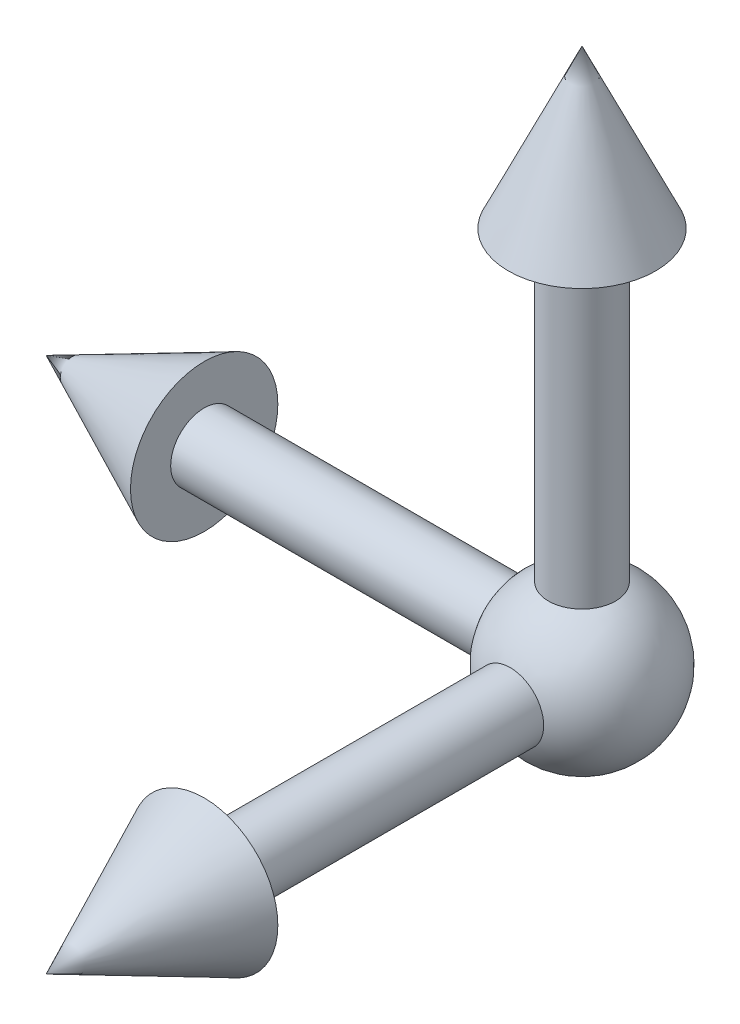
ISO-10303-21;
HEADER;
FILE_DESCRIPTION(('STEP AP214'),'2;1');
FILE_NAME('part.step','',(''),(''),'','','');
FILE_SCHEMA(('AUTOMOTIVE_DESIGN { 1 0 10303 214 1 1 1 1 }'));
ENDSEC;
DATA;
#1=APPLICATION_CONTEXT('core data for automotive mechanical design processes');
#2=APPLICATION_PROTOCOL_DEFINITION('international standard','automotive_design',2000,#1);
#3=PRODUCT_CONTEXT('',#1,'mechanical');
#4=PRODUCT('Part','Part','',(#3));
#5=PRODUCT_RELATED_PRODUCT_CATEGORY('part','',(#4));
#6=PRODUCT_DEFINITION_FORMATION('','',#4);
#7=PRODUCT_DEFINITION_CONTEXT('part definition',#1,'design');
#8=PRODUCT_DEFINITION('design','',#6,#7);
#9=PRODUCT_DEFINITION_SHAPE('','',#8);
#10=(LENGTH_UNIT() NAMED_UNIT(*) SI_UNIT(.MILLI.,.METRE.));
#11=(NAMED_UNIT(*) PLANE_ANGLE_UNIT() SI_UNIT($,.RADIAN.));
#12=(NAMED_UNIT(*) SI_UNIT($,.STERADIAN.) SOLID_ANGLE_UNIT());
#13=UNCERTAINTY_MEASURE_WITH_UNIT(LENGTH_MEASURE(1.E-05),#10,'distance_accuracy_value','');
#14=(GEOMETRIC_REPRESENTATION_CONTEXT(3) GLOBAL_UNCERTAINTY_ASSIGNED_CONTEXT((#13)) GLOBAL_UNIT_ASSIGNED_CONTEXT((#10,
#11,#12)) REPRESENTATION_CONTEXT('',''));
#15=CARTESIAN_POINT('',(0.,0.,0.));
#16=DIRECTION('',(0.,0.,1.));
#17=DIRECTION('',(1.,0.,0.));
#18=AXIS2_PLACEMENT_3D('',#15,#16,#17);
#19=CARTESIAN_POINT('',(0.,0.,0.));
#20=DIRECTION('',(-1.,0.,0.));
#21=DIRECTION('',(0.,0.,1.));
#22=AXIS2_PLACEMENT_3D('',#19,#20,#21);
#23=CYLINDRICAL_SURFACE('',#22,12.5);
#24=CARTESIAN_POINT('',(-26.8128533723539,0.,0.));
#25=DIRECTION('',(1.,0.,0.));
#26=DIRECTION('',(0.,0.,-1.));
#27=AXIS2_PLACEMENT_3D('',#24,#25,#26);
#28=CIRCLE('',#27,12.5);
#29=CARTESIAN_POINT('',(-26.8128533723539,0.,-12.5));
#30=VERTEX_POINT('',#29);
#31=EDGE_CURVE('E68',#30,#30,#28,.F.);
#32=ORIENTED_EDGE('',*,*,#31,.T.);
#33=EDGE_LOOP('',(#32));
#34=FACE_BOUND('',#33,.T.);
#35=CARTESIAN_POINT('',(-141.026059685986,0.,0.));
#36=DIRECTION('',(-1.,0.,0.));
#37=DIRECTION('',(0.,0.,1.));
#38=AXIS2_PLACEMENT_3D('',#35,#36,#37);
#39=CIRCLE('',#38,12.5);
#40=CARTESIAN_POINT('',(-141.026059685986,0.,12.5));
#41=VERTEX_POINT('',#40);
#42=EDGE_CURVE('E11',#41,#41,#39,.T.);
#43=ORIENTED_EDGE('',*,*,#42,.F.);
#44=EDGE_LOOP('',(#43));
#45=FACE_BOUND('',#44,.T.);
#46=ADVANCED_FACE('F39',(#34,#45),#23,.T.);
#47=CARTESIAN_POINT('',(-141.026059685986,12.5,0.));
#48=DIRECTION('',(-1.,0.,0.));
#49=DIRECTION('',(0.,0.,1.));
#50=AXIS2_PLACEMENT_3D('',#47,#48,#49);
#51=PLANE('',#50);
#52=CARTESIAN_POINT('',(-141.026059685986,0.,0.));
#53=DIRECTION('',(-1.,0.,0.));
#54=DIRECTION('',(0.,0.,1.));
#55=AXIS2_PLACEMENT_3D('',#52,#53,#54);
#56=CIRCLE('',#55,27.5);
#57=CARTESIAN_POINT('',(-141.026059685986,0.,27.5));
#58=VERTEX_POINT('',#57);
#59=EDGE_CURVE('E47',#58,#58,#56,.T.);
#60=ORIENTED_EDGE('',*,*,#59,.F.);
#61=EDGE_LOOP('',(#60));
#62=FACE_BOUND('',#61,.T.);
#63=ORIENTED_EDGE('',*,*,#42,.T.);
#64=EDGE_LOOP('',(#63));
#65=FACE_BOUND('',#64,.T.);
#66=ADVANCED_FACE('F88',(#62,#65),#51,.F.);
#67=CARTESIAN_POINT('',(-141.026059685986,0.,0.));
#68=DIRECTION('',(1.,0.,0.));
#69=DIRECTION('',(0.,0.,-1.));
#70=AXIS2_PLACEMENT_3D('',#67,#68,#69);
#71=CONICAL_SURFACE('',#70,27.5,0.436332312998576);
#72=CARTESIAN_POINT('',(-200.,0.,0.));
#73=VERTEX_POINT('',#72);
#74=VERTEX_LOOP('',#73);
#75=FACE_BOUND('',#74,.T.);
#76=ORIENTED_EDGE('',*,*,#59,.T.);
#77=EDGE_LOOP('',(#76));
#78=FACE_BOUND('',#77,.T.);
#79=ADVANCED_FACE('F86',(#75,#78),#71,.T.);
#80=CARTESIAN_POINT('',(0.,0.,0.));
#81=DIRECTION('',(-1.,0.,0.));
#82=DIRECTION('',(0.,1.,0.));
#83=AXIS2_PLACEMENT_3D('',#80,#81,#82);
#84=SPHERICAL_SURFACE('',#83,29.5834262039972);
#85=CARTESIAN_POINT('',(0.,26.8128533723539,0.));
#86=DIRECTION('',(0.,-1.,0.));
#87=DIRECTION('',(1.,0.,0.));
#88=AXIS2_PLACEMENT_3D('',#85,#86,#87);
#89=CIRCLE('',#88,12.5);
#90=CARTESIAN_POINT('',(12.5000000000001,26.8128533723539,0.));
#91=VERTEX_POINT('',#90);
#92=EDGE_CURVE('E42',#91,#91,#89,.F.);
#93=ORIENTED_EDGE('',*,*,#92,.F.);
#94=EDGE_LOOP('',(#93));
#95=FACE_BOUND('',#94,.T.);
#96=CARTESIAN_POINT('',(0.,0.,26.8128533723539));
#97=DIRECTION('',(0.,0.,-1.));
#98=DIRECTION('',(-1.,0.,0.));
#99=AXIS2_PLACEMENT_3D('',#96,#97,#98);
#100=CIRCLE('',#99,12.5);
#101=CARTESIAN_POINT('',(-12.4999999999999,0.,26.812853372354));
#102=VERTEX_POINT('',#101);
#103=EDGE_CURVE('E74',#102,#102,#100,.F.);
#104=ORIENTED_EDGE('',*,*,#103,.F.);
#105=EDGE_LOOP('',(#104));
#106=FACE_BOUND('',#105,.T.);
#107=ORIENTED_EDGE('',*,*,#31,.F.);
#108=EDGE_LOOP('',(#107));
#109=FACE_BOUND('',#108,.T.);
#110=ADVANCED_FACE('F100',(#95,#106,#109),#84,.T.);
#111=CARTESIAN_POINT('',(4.92389855684199E-13,0.,141.026059685986));
#112=DIRECTION('',(0.,0.,-1.));
#113=DIRECTION('',(-1.,0.,0.));
#114=AXIS2_PLACEMENT_3D('',#111,#112,#113);
#115=CONICAL_SURFACE('',#114,27.5,0.436332312998576);
#116=CARTESIAN_POINT('',(6.98296267768627E-13,0.,200.));
#117=VERTEX_POINT('',#116);
#118=VERTEX_LOOP('',#117);
#119=FACE_BOUND('',#118,.T.);
#120=CARTESIAN_POINT('',(4.92389855684199E-13,0.,141.026059685986));
#121=DIRECTION('',(0.,0.,1.));
#122=DIRECTION('',(1.,0.,0.));
#123=AXIS2_PLACEMENT_3D('',#120,#121,#122);
#124=CIRCLE('',#123,27.5);
#125=CARTESIAN_POINT('',(27.5000000000005,0.,141.026059685986));
#126=VERTEX_POINT('',#125);
#127=EDGE_CURVE('E71',#126,#126,#124,.T.);
#128=ORIENTED_EDGE('',*,*,#127,.T.);
#129=EDGE_LOOP('',(#128));
#130=FACE_BOUND('',#129,.T.);
#131=ADVANCED_FACE('F101',(#119,#130),#115,.T.);
#132=CARTESIAN_POINT('',(4.92389855684199E-13,12.5,141.026059685986));
#133=DIRECTION('',(0.,0.,1.));
#134=DIRECTION('',(1.,0.,0.));
#135=AXIS2_PLACEMENT_3D('',#132,#133,#134);
#136=PLANE('',#135);
#137=ORIENTED_EDGE('',*,*,#127,.F.);
#138=EDGE_LOOP('',(#137));
#139=FACE_BOUND('',#138,.T.);
#140=CARTESIAN_POINT('',(4.92389855684199E-13,0.,141.026059685986));
#141=DIRECTION('',(0.,0.,1.));
#142=DIRECTION('',(1.,0.,0.));
#143=AXIS2_PLACEMENT_3D('',#140,#141,#142);
#144=CIRCLE('',#143,12.5);
#145=CARTESIAN_POINT('',(12.5000000000005,0.,141.026059685986));
#146=VERTEX_POINT('',#145);
#147=EDGE_CURVE('E80',#146,#146,#144,.T.);
#148=ORIENTED_EDGE('',*,*,#147,.T.);
#149=EDGE_LOOP('',(#148));
#150=FACE_BOUND('',#149,.T.);
#151=ADVANCED_FACE('F108',(#139,#150),#136,.F.);
#152=CARTESIAN_POINT('',(0.,0.,0.));
#153=DIRECTION('',(0.,0.,1.));
#154=DIRECTION('',(1.,0.,0.));
#155=AXIS2_PLACEMENT_3D('',#152,#153,#154);
#156=CYLINDRICAL_SURFACE('',#155,12.5);
#157=ORIENTED_EDGE('',*,*,#103,.T.);
#158=EDGE_LOOP('',(#157));
#159=FACE_BOUND('',#158,.T.);
#160=ORIENTED_EDGE('',*,*,#147,.F.);
#161=EDGE_LOOP('',(#160));
#162=FACE_BOUND('',#161,.T.);
#163=ADVANCED_FACE('F61',(#159,#162),#156,.T.);
#164=CARTESIAN_POINT('',(4.92389855684199E-13,141.026059685986,0.));
#165=DIRECTION('',(0.,-1.,0.));
#166=DIRECTION('',(0.,0.,-1.));
#167=AXIS2_PLACEMENT_3D('',#164,#165,#166);
#168=CONICAL_SURFACE('',#167,27.5,0.436332312998576);
#169=CARTESIAN_POINT('',(6.98296267768627E-13,200.,0.));
#170=VERTEX_POINT('',#169);
#171=VERTEX_LOOP('',#170);
#172=FACE_BOUND('',#171,.T.);
#173=CARTESIAN_POINT('',(4.92389855684199E-13,141.026059685986,0.));
#174=DIRECTION('',(0.,1.,0.));
#175=DIRECTION('',(0.,0.,1.));
#176=AXIS2_PLACEMENT_3D('',#173,#174,#175);
#177=CIRCLE('',#176,27.5);
#178=CARTESIAN_POINT('',(4.92389855684199E-13,141.026059685986,27.5));
#179=VERTEX_POINT('',#178);
#180=EDGE_CURVE('E65',#179,#179,#177,.T.);
#181=ORIENTED_EDGE('',*,*,#180,.T.);
#182=EDGE_LOOP('',(#181));
#183=FACE_BOUND('',#182,.T.);
#184=ADVANCED_FACE('F57',(#172,#183),#168,.T.);
#185=CARTESIAN_POINT('',(12.5000000000005,141.026059685986,0.));
#186=DIRECTION('',(0.,1.,0.));
#187=DIRECTION('',(0.,0.,1.));
#188=AXIS2_PLACEMENT_3D('',#185,#186,#187);
#189=PLANE('',#188);
#190=ORIENTED_EDGE('',*,*,#180,.F.);
#191=EDGE_LOOP('',(#190));
#192=FACE_BOUND('',#191,.T.);
#193=CARTESIAN_POINT('',(4.92389855684199E-13,141.026059685986,0.));
#194=DIRECTION('',(0.,1.,0.));
#195=DIRECTION('',(0.,0.,1.));
#196=AXIS2_PLACEMENT_3D('',#193,#194,#195);
#197=CIRCLE('',#196,12.5);
#198=CARTESIAN_POINT('',(4.92389855684199E-13,141.026059685986,12.5));
#199=VERTEX_POINT('',#198);
#200=EDGE_CURVE('E67',#199,#199,#197,.T.);
#201=ORIENTED_EDGE('',*,*,#200,.T.);
#202=EDGE_LOOP('',(#201));
#203=FACE_BOUND('',#202,.T.);
#204=ADVANCED_FACE('F60',(#192,#203),#189,.F.);
#205=CARTESIAN_POINT('',(0.,0.,0.));
#206=DIRECTION('',(0.,1.,0.));
#207=DIRECTION('',(0.,0.,1.));
#208=AXIS2_PLACEMENT_3D('',#205,#206,#207);
#209=CYLINDRICAL_SURFACE('',#208,12.5);
#210=ORIENTED_EDGE('',*,*,#92,.T.);
#211=EDGE_LOOP('',(#210));
#212=FACE_BOUND('',#211,.T.);
#213=ORIENTED_EDGE('',*,*,#200,.F.);
#214=EDGE_LOOP('',(#213));
#215=FACE_BOUND('',#214,.T.);
#216=ADVANCED_FACE('F117',(#212,#215),#209,.T.);
#217=CLOSED_SHELL('',(#46,#66,#79,#110,#131,#151,#163,#184,#204,#216));
#218=MANIFOLD_SOLID_BREP('B2',#217);
#219=ADVANCED_BREP_SHAPE_REPRESENTATION('',(#18,#218),#14);
#220=SHAPE_DEFINITION_REPRESENTATION(#9,#219);
ENDSEC;
END-ISO-10303-21;
